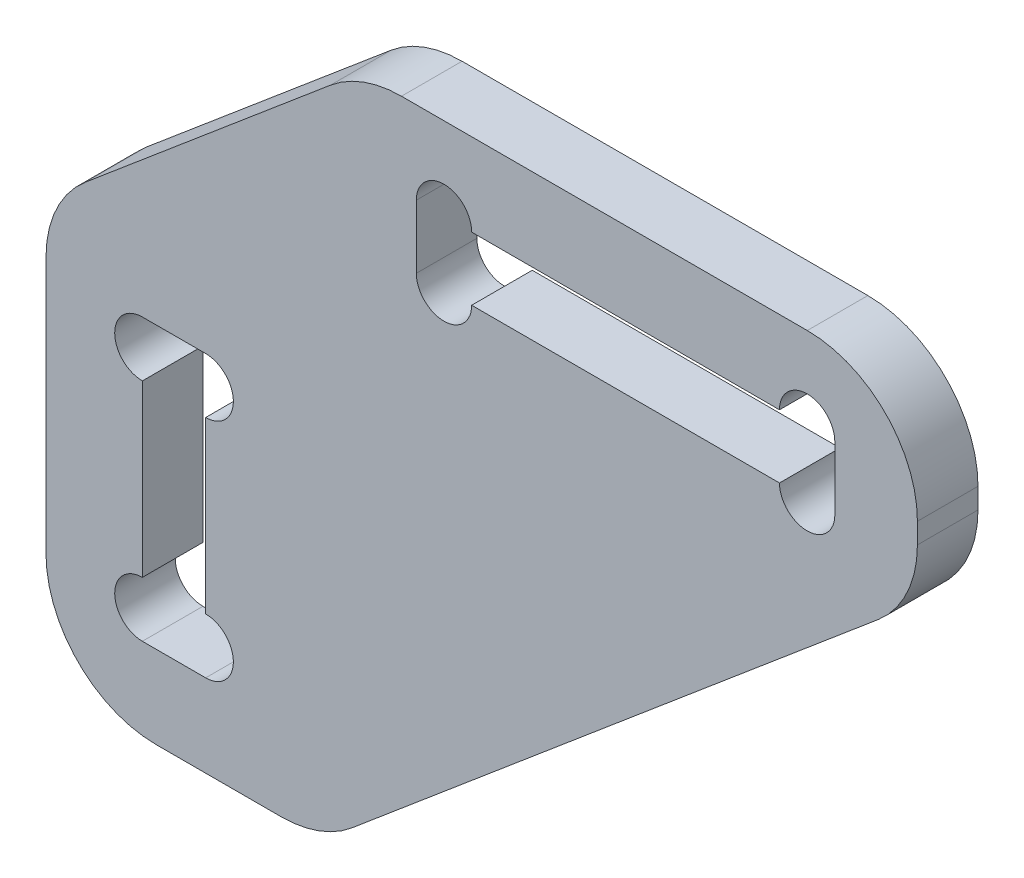
ISO-10303-21;
HEADER;
FILE_DESCRIPTION(('STEP AP214'),'2;1');
FILE_NAME('part.step','',(''),(''),'','','');
FILE_SCHEMA(('AUTOMOTIVE_DESIGN { 1 0 10303 214 1 1 1 1 }'));
ENDSEC;
DATA;
#1=APPLICATION_CONTEXT('core data for automotive mechanical design processes');
#2=APPLICATION_PROTOCOL_DEFINITION('international standard','automotive_design',2000,#1);
#3=PRODUCT_CONTEXT('',#1,'mechanical');
#4=PRODUCT('Part','Part','',(#3));
#5=PRODUCT_RELATED_PRODUCT_CATEGORY('part','',(#4));
#6=PRODUCT_DEFINITION_FORMATION('','',#4);
#7=PRODUCT_DEFINITION_CONTEXT('part definition',#1,'design');
#8=PRODUCT_DEFINITION('design','',#6,#7);
#9=PRODUCT_DEFINITION_SHAPE('','',#8);
#10=(LENGTH_UNIT() NAMED_UNIT(*) SI_UNIT(.MILLI.,.METRE.));
#11=(NAMED_UNIT(*) PLANE_ANGLE_UNIT() SI_UNIT($,.RADIAN.));
#12=(NAMED_UNIT(*) SI_UNIT($,.STERADIAN.) SOLID_ANGLE_UNIT());
#13=UNCERTAINTY_MEASURE_WITH_UNIT(LENGTH_MEASURE(1.E-05),#10,'distance_accuracy_value','');
#14=(GEOMETRIC_REPRESENTATION_CONTEXT(3) GLOBAL_UNCERTAINTY_ASSIGNED_CONTEXT((#13)) GLOBAL_UNIT_ASSIGNED_CONTEXT((#10,
#11,#12)) REPRESENTATION_CONTEXT('',''));
#15=CARTESIAN_POINT('',(0.,0.,0.));
#16=DIRECTION('',(0.,0.,1.));
#17=DIRECTION('',(1.,0.,0.));
#18=AXIS2_PLACEMENT_3D('',#15,#16,#17);
#19=CARTESIAN_POINT('',(-6.03197625153306,7.15711171814026,2.2));
#20=DIRECTION('',(-0.644444166774471,0.764651368867118,0.));
#21=DIRECTION('',(-0.764651368867118,-0.644444166774471,0.));
#22=AXIS2_PLACEMENT_3D('',#19,#20,#21);
#23=PLANE('',#22);
#24=DIRECTION('',(0.764651368867119,0.644444166774471,0.));
#25=VECTOR('',#24,1.);
#26=CARTESIAN_POINT('',(-6.03197625153306,7.15711171814026,0.));
#27=LINE('',#26,#25);
#28=CARTESIAN_POINT('',(-19.6277766670979,-4.30135762772878,0.));
#29=VERTEX_POINT('',#28);
#30=CARTESIAN_POINT('',(-10.7169914306618,3.20860547546847,0.));
#31=VERTEX_POINT('',#30);
#32=EDGE_CURVE('E353',#29,#31,#27,.T.);
#33=ORIENTED_EDGE('',*,*,#32,.F.);
#34=DIRECTION('',(0.,0.,-1.));
#35=VECTOR('',#34,1.);
#36=CARTESIAN_POINT('',(-19.6277766670979,-4.30135762772878,2.2));
#37=LINE('',#36,#35);
#38=CARTESIAN_POINT('',(-19.6277766670979,-4.30135762772878,2.2));
#39=VERTEX_POINT('',#38);
#40=EDGE_CURVE('E11',#29,#39,#37,.F.);
#41=ORIENTED_EDGE('',*,*,#40,.T.);
#42=DIRECTION('',(0.764651368867119,0.644444166774471,0.));
#43=VECTOR('',#42,1.);
#44=CARTESIAN_POINT('',(-6.03197625153306,7.15711171814026,2.2));
#45=LINE('',#44,#43);
#46=CARTESIAN_POINT('',(-10.7169914306618,3.20860547546847,2.2));
#47=VERTEX_POINT('',#46);
#48=EDGE_CURVE('E290',#39,#47,#45,.T.);
#49=ORIENTED_EDGE('',*,*,#48,.T.);
#50=DIRECTION('',(0.,0.,-1.));
#51=VECTOR('',#50,1.);
#52=CARTESIAN_POINT('',(-10.7169914306618,3.20860547546847,2.2));
#53=LINE('',#52,#51);
#54=EDGE_CURVE('E44',#47,#31,#53,.T.);
#55=ORIENTED_EDGE('',*,*,#54,.T.);
#56=EDGE_LOOP('',(#33,#41,#49,#55));
#57=FACE_BOUND('',#56,.T.);
#58=ADVANCED_FACE('F36',(#57),#23,.T.);
#59=CARTESIAN_POINT('',(-21.05,0.,2.2));
#60=DIRECTION('',(-1.,0.,0.));
#61=DIRECTION('',(0.,0.,1.));
#62=AXIS2_PLACEMENT_3D('',#59,#60,#61);
#63=PLANE('',#62);
#64=DIRECTION('',(0.,1.,0.));
#65=VECTOR('',#64,1.);
#66=CARTESIAN_POINT('',(-21.05,0.,0.));
#67=LINE('',#66,#65);
#68=CARTESIAN_POINT('',(-21.05,-16.7,0.));
#69=VERTEX_POINT('',#68);
#70=CARTESIAN_POINT('',(-21.05,-7.35996310319725,0.));
#71=VERTEX_POINT('',#70);
#72=EDGE_CURVE('E356',#69,#71,#67,.T.);
#73=ORIENTED_EDGE('',*,*,#72,.F.);
#74=DIRECTION('',(0.,0.,-1.));
#75=VECTOR('',#74,1.);
#76=CARTESIAN_POINT('',(-21.05,-16.7,2.2));
#77=LINE('',#76,#75);
#78=CARTESIAN_POINT('',(-21.05,-16.7,2.2));
#79=VERTEX_POINT('',#78);
#80=EDGE_CURVE('E439',#69,#79,#77,.F.);
#81=ORIENTED_EDGE('',*,*,#80,.T.);
#82=DIRECTION('',(0.,1.,0.));
#83=VECTOR('',#82,1.);
#84=CARTESIAN_POINT('',(-21.05,0.,2.2));
#85=LINE('',#84,#83);
#86=CARTESIAN_POINT('',(-21.05,-7.35996310319725,2.2));
#87=VERTEX_POINT('',#86);
#88=EDGE_CURVE('E293',#79,#87,#85,.T.);
#89=ORIENTED_EDGE('',*,*,#88,.T.);
#90=DIRECTION('',(0.,0.,-1.));
#91=VECTOR('',#90,1.);
#92=CARTESIAN_POINT('',(-21.05,-7.35996310319725,2.2));
#93=LINE('',#92,#91);
#94=EDGE_CURVE('E436',#87,#71,#93,.T.);
#95=ORIENTED_EDGE('',*,*,#94,.T.);
#96=EDGE_LOOP('',(#73,#81,#89,#95));
#97=FACE_BOUND('',#96,.T.);
#98=ADVANCED_FACE('F457',(#97),#63,.T.);
#99=CARTESIAN_POINT('',(0.,-20.7,2.2));
#100=DIRECTION('',(0.,-1.,0.));
#101=DIRECTION('',(0.,0.,-1.));
#102=AXIS2_PLACEMENT_3D('',#99,#100,#101);
#103=PLANE('',#102);
#104=DIRECTION('',(-1.,0.,0.));
#105=VECTOR('',#104,1.);
#106=CARTESIAN_POINT('',(0.,-20.7,0.));
#107=LINE('',#106,#105);
#108=CARTESIAN_POINT('',(-12.5107852364361,-20.7,0.));
#109=VERTEX_POINT('',#108);
#110=CARTESIAN_POINT('',(-17.05,-20.7,0.));
#111=VERTEX_POINT('',#110);
#112=EDGE_CURVE('E359',#109,#111,#107,.T.);
#113=ORIENTED_EDGE('',*,*,#112,.F.);
#114=DIRECTION('',(0.,0.,-1.));
#115=VECTOR('',#114,1.);
#116=CARTESIAN_POINT('',(-12.5107852364361,-20.7,2.2));
#117=LINE('',#116,#115);
#118=CARTESIAN_POINT('',(-12.5107852364361,-20.7,2.2));
#119=VERTEX_POINT('',#118);
#120=EDGE_CURVE('E434',#109,#119,#117,.F.);
#121=ORIENTED_EDGE('',*,*,#120,.T.);
#122=DIRECTION('',(-1.,0.,0.));
#123=VECTOR('',#122,1.);
#124=CARTESIAN_POINT('',(0.,-20.7,2.2));
#125=LINE('',#124,#123);
#126=CARTESIAN_POINT('',(-17.05,-20.7,2.2));
#127=VERTEX_POINT('',#126);
#128=EDGE_CURVE('E296',#119,#127,#125,.T.);
#129=ORIENTED_EDGE('',*,*,#128,.T.);
#130=DIRECTION('',(0.,0.,-1.));
#131=VECTOR('',#130,1.);
#132=CARTESIAN_POINT('',(-17.05,-20.7,2.2));
#133=LINE('',#132,#131);
#134=EDGE_CURVE('E431',#127,#111,#133,.T.);
#135=ORIENTED_EDGE('',*,*,#134,.T.);
#136=EDGE_LOOP('',(#113,#121,#129,#135));
#137=FACE_BOUND('',#136,.T.);
#138=ADVANCED_FACE('F467',(#137),#103,.T.);
#139=CARTESIAN_POINT('',(5.6112883264578,-6.65795350652247,2.2));
#140=DIRECTION('',(0.644444166774471,-0.764651368867118,0.));
#141=DIRECTION('',(0.764651368867118,0.644444166774471,0.));
#142=AXIS2_PLACEMENT_3D('',#139,#140,#141);
#143=PLANE('',#142);
#144=DIRECTION('',(-0.764651368867118,-0.644444166774471,0.));
#145=VECTOR('',#144,1.);
#146=CARTESIAN_POINT('',(5.6112883264578,-6.65795350652247,0.));
#147=LINE('',#146,#145);
#148=CARTESIAN_POINT('',(9.17777666709789,-3.65213582205287,0.));
#149=VERTEX_POINT('',#148);
#150=CARTESIAN_POINT('',(-9.93300856933824,-19.7586054754685,0.));
#151=VERTEX_POINT('',#150);
#152=EDGE_CURVE('E362',#149,#151,#147,.T.);
#153=ORIENTED_EDGE('',*,*,#152,.F.);
#154=DIRECTION('',(0.,0.,-1.));
#155=VECTOR('',#154,1.);
#156=CARTESIAN_POINT('',(9.17777666709789,-3.65213582205287,2.2));
#157=LINE('',#156,#155);
#158=CARTESIAN_POINT('',(9.17777666709789,-3.65213582205287,2.2));
#159=VERTEX_POINT('',#158);
#160=EDGE_CURVE('E58',#149,#159,#157,.F.);
#161=ORIENTED_EDGE('',*,*,#160,.T.);
#162=DIRECTION('',(-0.764651368867118,-0.644444166774471,0.));
#163=VECTOR('',#162,1.);
#164=CARTESIAN_POINT('',(5.6112883264578,-6.65795350652247,2.2));
#165=LINE('',#164,#163);
#166=CARTESIAN_POINT('',(-9.93300856933824,-19.7586054754685,2.2));
#167=VERTEX_POINT('',#166);
#168=EDGE_CURVE('E299',#159,#167,#165,.T.);
#169=ORIENTED_EDGE('',*,*,#168,.T.);
#170=DIRECTION('',(0.,0.,-1.));
#171=VECTOR('',#170,1.);
#172=CARTESIAN_POINT('',(-9.93300856933824,-19.7586054754685,2.2));
#173=LINE('',#172,#171);
#174=EDGE_CURVE('E427',#167,#151,#173,.T.);
#175=ORIENTED_EDGE('',*,*,#174,.T.);
#176=EDGE_LOOP('',(#153,#161,#169,#175));
#177=FACE_BOUND('',#176,.T.);
#178=ADVANCED_FACE('F472',(#177),#143,.T.);
#179=CARTESIAN_POINT('',(10.6,0.,2.2));
#180=DIRECTION('',(1.,0.,0.));
#181=DIRECTION('',(0.,1.,0.));
#182=AXIS2_PLACEMENT_3D('',#179,#180,#181);
#183=PLANE('',#182);
#184=DIRECTION('',(0.,-1.,0.));
#185=VECTOR('',#184,1.);
#186=CARTESIAN_POINT('',(10.6,0.,0.));
#187=LINE('',#186,#185);
#188=CARTESIAN_POINT('',(10.6,0.149999999999998,0.));
#189=VERTEX_POINT('',#188);
#190=CARTESIAN_POINT('',(10.6,-0.5935303465844,0.));
#191=VERTEX_POINT('',#190);
#192=EDGE_CURVE('E252',#189,#191,#187,.T.);
#193=ORIENTED_EDGE('',*,*,#192,.F.);
#194=DIRECTION('',(0.,0.,-1.));
#195=VECTOR('',#194,1.);
#196=CARTESIAN_POINT('',(10.6,0.149999999999998,2.2));
#197=LINE('',#196,#195);
#198=CARTESIAN_POINT('',(10.6,0.149999999999998,2.2));
#199=VERTEX_POINT('',#198);
#200=EDGE_CURVE('E414',#189,#199,#197,.F.);
#201=ORIENTED_EDGE('',*,*,#200,.T.);
#202=DIRECTION('',(0.,-1.,0.));
#203=VECTOR('',#202,1.);
#204=CARTESIAN_POINT('',(10.6,0.,2.2));
#205=LINE('',#204,#203);
#206=CARTESIAN_POINT('',(10.6,-0.5935303465844,2.2));
#207=VERTEX_POINT('',#206);
#208=EDGE_CURVE('E301',#199,#207,#205,.T.);
#209=ORIENTED_EDGE('',*,*,#208,.T.);
#210=DIRECTION('',(0.,0.,-1.));
#211=VECTOR('',#210,1.);
#212=CARTESIAN_POINT('',(10.6,-0.5935303465844,2.2));
#213=LINE('',#212,#211);
#214=EDGE_CURVE('E411',#207,#191,#213,.T.);
#215=ORIENTED_EDGE('',*,*,#214,.T.);
#216=EDGE_LOOP('',(#193,#201,#209,#215));
#217=FACE_BOUND('',#216,.T.);
#218=ADVANCED_FACE('F479',(#217),#183,.T.);
#219=CARTESIAN_POINT('',(6.595,1.15,2.2));
#220=DIRECTION('',(0.,0.,-1.));
#221=DIRECTION('',(-1.,0.,0.));
#222=AXIS2_PLACEMENT_3D('',#219,#220,#221);
#223=CYLINDRICAL_SURFACE('',#222,1.005);
#224=CARTESIAN_POINT('',(6.595,1.15,0.));
#225=DIRECTION('',(0.,0.,1.));
#226=DIRECTION('',(1.,0.,0.));
#227=AXIS2_PLACEMENT_3D('',#224,#225,#226);
#228=CIRCLE('',#227,1.005);
#229=CARTESIAN_POINT('',(7.6,1.15,0.));
#230=VERTEX_POINT('',#229);
#231=CARTESIAN_POINT('',(5.59,1.15,0.));
#232=VERTEX_POINT('',#231);
#233=EDGE_CURVE('E329',#230,#232,#228,.T.);
#234=ORIENTED_EDGE('',*,*,#233,.F.);
#235=DIRECTION('',(0.,0.,-1.));
#236=VECTOR('',#235,1.);
#237=CARTESIAN_POINT('',(7.6,1.15,2.2));
#238=LINE('',#237,#236);
#239=CARTESIAN_POINT('',(7.6,1.15,2.2));
#240=VERTEX_POINT('',#239);
#241=EDGE_CURVE('E380',#240,#230,#238,.T.);
#242=ORIENTED_EDGE('',*,*,#241,.F.);
#243=CARTESIAN_POINT('',(6.595,1.15,2.2));
#244=DIRECTION('',(0.,0.,1.));
#245=DIRECTION('',(1.,0.,0.));
#246=AXIS2_PLACEMENT_3D('',#243,#244,#245);
#247=CIRCLE('',#246,1.005);
#248=CARTESIAN_POINT('',(5.59,1.15,2.2));
#249=VERTEX_POINT('',#248);
#250=EDGE_CURVE('E268',#240,#249,#247,.T.);
#251=ORIENTED_EDGE('',*,*,#250,.T.);
#252=DIRECTION('',(0.,0.,-1.));
#253=VECTOR('',#252,1.);
#254=CARTESIAN_POINT('',(5.59,1.15,2.2));
#255=LINE('',#254,#253);
#256=EDGE_CURVE('E233',#249,#232,#255,.T.);
#257=ORIENTED_EDGE('',*,*,#256,.T.);
#258=EDGE_LOOP('',(#234,#242,#251,#257));
#259=FACE_BOUND('',#258,.T.);
#260=ADVANCED_FACE('F530',(#259),#223,.F.);
#261=CARTESIAN_POINT('',(7.6,0.,2.2));
#262=DIRECTION('',(-1.,0.,0.));
#263=DIRECTION('',(0.,0.,1.));
#264=AXIS2_PLACEMENT_3D('',#261,#262,#263);
#265=PLANE('',#264);
#266=DIRECTION('',(0.,1.,0.));
#267=VECTOR('',#266,1.);
#268=CARTESIAN_POINT('',(7.6,0.,0.));
#269=LINE('',#268,#267);
#270=CARTESIAN_POINT('',(7.6,-1.15,0.));
#271=VERTEX_POINT('',#270);
#272=EDGE_CURVE('E332',#271,#230,#269,.T.);
#273=ORIENTED_EDGE('',*,*,#272,.F.);
#274=DIRECTION('',(0.,0.,-1.));
#275=VECTOR('',#274,1.);
#276=CARTESIAN_POINT('',(7.6,-1.15,2.2));
#277=LINE('',#276,#275);
#278=CARTESIAN_POINT('',(7.6,-1.15,2.2));
#279=VERTEX_POINT('',#278);
#280=EDGE_CURVE('E378',#279,#271,#277,.T.);
#281=ORIENTED_EDGE('',*,*,#280,.F.);
#282=DIRECTION('',(0.,1.,0.));
#283=VECTOR('',#282,1.);
#284=CARTESIAN_POINT('',(7.6,0.,2.2));
#285=LINE('',#284,#283);
#286=EDGE_CURVE('E271',#279,#240,#285,.T.);
#287=ORIENTED_EDGE('',*,*,#286,.T.);
#288=ORIENTED_EDGE('',*,*,#241,.T.);
#289=EDGE_LOOP('',(#273,#281,#287,#288));
#290=FACE_BOUND('',#289,.T.);
#291=ADVANCED_FACE('F526',(#290),#265,.T.);
#292=CARTESIAN_POINT('',(6.595,-1.15,2.2));
#293=DIRECTION('',(0.,0.,-1.));
#294=DIRECTION('',(-1.,0.,0.));
#295=AXIS2_PLACEMENT_3D('',#292,#293,#294);
#296=CYLINDRICAL_SURFACE('',#295,1.005);
#297=CARTESIAN_POINT('',(6.595,-1.15,0.));
#298=DIRECTION('',(0.,0.,1.));
#299=DIRECTION('',(1.,0.,0.));
#300=AXIS2_PLACEMENT_3D('',#297,#298,#299);
#301=CIRCLE('',#300,1.005);
#302=CARTESIAN_POINT('',(5.59,-1.15,0.));
#303=VERTEX_POINT('',#302);
#304=EDGE_CURVE('E335',#303,#271,#301,.T.);
#305=ORIENTED_EDGE('',*,*,#304,.F.);
#306=DIRECTION('',(0.,0.,-1.));
#307=VECTOR('',#306,1.);
#308=CARTESIAN_POINT('',(5.59,-1.15,2.2));
#309=LINE('',#308,#307);
#310=CARTESIAN_POINT('',(5.59,-1.15,2.2));
#311=VERTEX_POINT('',#310);
#312=EDGE_CURVE('E376',#311,#303,#309,.T.);
#313=ORIENTED_EDGE('',*,*,#312,.F.);
#314=CARTESIAN_POINT('',(6.595,-1.15,2.2));
#315=DIRECTION('',(0.,0.,1.));
#316=DIRECTION('',(1.,0.,0.));
#317=AXIS2_PLACEMENT_3D('',#314,#315,#316);
#318=CIRCLE('',#317,1.005);
#319=EDGE_CURVE('E274',#311,#279,#318,.T.);
#320=ORIENTED_EDGE('',*,*,#319,.T.);
#321=ORIENTED_EDGE('',*,*,#280,.T.);
#322=EDGE_LOOP('',(#305,#313,#320,#321));
#323=FACE_BOUND('',#322,.T.);
#324=ADVANCED_FACE('F522',(#323),#296,.F.);
#325=CARTESIAN_POINT('',(0.,-1.15,2.2));
#326=DIRECTION('',(0.,-1.,0.));
#327=DIRECTION('',(1.,0.,0.));
#328=AXIS2_PLACEMENT_3D('',#325,#326,#327);
#329=PLANE('',#328);
#330=DIRECTION('',(-1.,0.,0.));
#331=VECTOR('',#330,1.);
#332=CARTESIAN_POINT('',(0.,-1.15,0.));
#333=LINE('',#332,#331);
#334=CARTESIAN_POINT('',(-5.59,-1.15,0.));
#335=VERTEX_POINT('',#334);
#336=EDGE_CURVE('E338',#303,#335,#333,.T.);
#337=ORIENTED_EDGE('',*,*,#336,.T.);
#338=DIRECTION('',(0.,0.,-1.));
#339=VECTOR('',#338,1.);
#340=CARTESIAN_POINT('',(-5.59,-1.15,2.2));
#341=LINE('',#340,#339);
#342=CARTESIAN_POINT('',(-5.59,-1.15,2.2));
#343=VERTEX_POINT('',#342);
#344=EDGE_CURVE('E374',#343,#335,#341,.T.);
#345=ORIENTED_EDGE('',*,*,#344,.F.);
#346=DIRECTION('',(-1.,0.,0.));
#347=VECTOR('',#346,1.);
#348=CARTESIAN_POINT('',(0.,-1.15,2.2));
#349=LINE('',#348,#347);
#350=EDGE_CURVE('E277',#311,#343,#349,.T.);
#351=ORIENTED_EDGE('',*,*,#350,.F.);
#352=ORIENTED_EDGE('',*,*,#312,.T.);
#353=EDGE_LOOP('',(#337,#345,#351,#352));
#354=FACE_BOUND('',#353,.T.);
#355=ADVANCED_FACE('F518',(#354),#329,.F.);
#356=CARTESIAN_POINT('',(-6.595,-1.15,2.2));
#357=DIRECTION('',(0.,0.,-1.));
#358=DIRECTION('',(-1.,0.,0.));
#359=AXIS2_PLACEMENT_3D('',#356,#357,#358);
#360=CYLINDRICAL_SURFACE('',#359,1.005);
#361=CARTESIAN_POINT('',(-6.595,-1.15,0.));
#362=DIRECTION('',(0.,0.,1.));
#363=DIRECTION('',(1.,0.,0.));
#364=AXIS2_PLACEMENT_3D('',#361,#362,#363);
#365=CIRCLE('',#364,1.005);
#366=CARTESIAN_POINT('',(-7.6,-1.15,0.));
#367=VERTEX_POINT('',#366);
#368=EDGE_CURVE('E341',#367,#335,#365,.T.);
#369=ORIENTED_EDGE('',*,*,#368,.F.);
#370=DIRECTION('',(0.,0.,-1.));
#371=VECTOR('',#370,1.);
#372=CARTESIAN_POINT('',(-7.6,-1.15,2.2));
#373=LINE('',#372,#371);
#374=CARTESIAN_POINT('',(-7.6,-1.15,2.2));
#375=VERTEX_POINT('',#374);
#376=EDGE_CURVE('E372',#375,#367,#373,.T.);
#377=ORIENTED_EDGE('',*,*,#376,.F.);
#378=CARTESIAN_POINT('',(-6.595,-1.15,2.2));
#379=DIRECTION('',(0.,0.,1.));
#380=DIRECTION('',(1.,0.,0.));
#381=AXIS2_PLACEMENT_3D('',#378,#379,#380);
#382=CIRCLE('',#381,1.005);
#383=EDGE_CURVE('E279',#375,#343,#382,.T.);
#384=ORIENTED_EDGE('',*,*,#383,.T.);
#385=ORIENTED_EDGE('',*,*,#344,.T.);
#386=EDGE_LOOP('',(#369,#377,#384,#385));
#387=FACE_BOUND('',#386,.T.);
#388=ADVANCED_FACE('F514',(#387),#360,.F.);
#389=CARTESIAN_POINT('',(-7.6,0.,2.2));
#390=DIRECTION('',(-1.,0.,0.));
#391=DIRECTION('',(0.,0.,1.));
#392=AXIS2_PLACEMENT_3D('',#389,#390,#391);
#393=PLANE('',#392);
#394=DIRECTION('',(0.,1.,0.));
#395=VECTOR('',#394,1.);
#396=CARTESIAN_POINT('',(-7.6,0.,0.));
#397=LINE('',#396,#395);
#398=CARTESIAN_POINT('',(-7.6,1.15,0.));
#399=VERTEX_POINT('',#398);
#400=EDGE_CURVE('E344',#367,#399,#397,.T.);
#401=ORIENTED_EDGE('',*,*,#400,.T.);
#402=DIRECTION('',(0.,0.,-1.));
#403=VECTOR('',#402,1.);
#404=CARTESIAN_POINT('',(-7.6,1.15,2.2));
#405=LINE('',#404,#403);
#406=CARTESIAN_POINT('',(-7.6,1.15,2.2));
#407=VERTEX_POINT('',#406);
#408=EDGE_CURVE('E370',#407,#399,#405,.T.);
#409=ORIENTED_EDGE('',*,*,#408,.F.);
#410=DIRECTION('',(0.,1.,0.));
#411=VECTOR('',#410,1.);
#412=CARTESIAN_POINT('',(-7.6,0.,2.2));
#413=LINE('',#412,#411);
#414=EDGE_CURVE('E282',#375,#407,#413,.T.);
#415=ORIENTED_EDGE('',*,*,#414,.F.);
#416=ORIENTED_EDGE('',*,*,#376,.T.);
#417=EDGE_LOOP('',(#401,#409,#415,#416));
#418=FACE_BOUND('',#417,.T.);
#419=ADVANCED_FACE('F510',(#418),#393,.F.);
#420=CARTESIAN_POINT('',(-6.595,1.15,2.2));
#421=DIRECTION('',(0.,0.,-1.));
#422=DIRECTION('',(-1.,0.,0.));
#423=AXIS2_PLACEMENT_3D('',#420,#421,#422);
#424=CYLINDRICAL_SURFACE('',#423,1.005);
#425=CARTESIAN_POINT('',(-6.595,1.15,0.));
#426=DIRECTION('',(0.,0.,1.));
#427=DIRECTION('',(1.,0.,0.));
#428=AXIS2_PLACEMENT_3D('',#425,#426,#427);
#429=CIRCLE('',#428,1.005);
#430=CARTESIAN_POINT('',(-5.59,1.15,0.));
#431=VERTEX_POINT('',#430);
#432=EDGE_CURVE('E347',#431,#399,#429,.T.);
#433=ORIENTED_EDGE('',*,*,#432,.F.);
#434=DIRECTION('',(0.,0.,-1.));
#435=VECTOR('',#434,1.);
#436=CARTESIAN_POINT('',(-5.59,1.15,2.2));
#437=LINE('',#436,#435);
#438=CARTESIAN_POINT('',(-5.59,1.15,2.2));
#439=VERTEX_POINT('',#438);
#440=EDGE_CURVE('E368',#439,#431,#437,.T.);
#441=ORIENTED_EDGE('',*,*,#440,.F.);
#442=CARTESIAN_POINT('',(-6.595,1.15,2.2));
#443=DIRECTION('',(0.,0.,1.));
#444=DIRECTION('',(1.,0.,0.));
#445=AXIS2_PLACEMENT_3D('',#442,#443,#444);
#446=CIRCLE('',#445,1.005);
#447=EDGE_CURVE('E284',#439,#407,#446,.T.);
#448=ORIENTED_EDGE('',*,*,#447,.T.);
#449=ORIENTED_EDGE('',*,*,#408,.T.);
#450=EDGE_LOOP('',(#433,#441,#448,#449));
#451=FACE_BOUND('',#450,.T.);
#452=ADVANCED_FACE('F507',(#451),#424,.F.);
#453=CARTESIAN_POINT('',(-15.25,-16.695,2.2));
#454=DIRECTION('',(0.,0.,-1.));
#455=DIRECTION('',(-1.,0.,0.));
#456=AXIS2_PLACEMENT_3D('',#453,#454,#455);
#457=CYLINDRICAL_SURFACE('',#456,1.005);
#458=CARTESIAN_POINT('',(-15.25,-16.695,0.));
#459=DIRECTION('',(0.,0.,1.));
#460=DIRECTION('',(1.,0.,0.));
#461=AXIS2_PLACEMENT_3D('',#458,#459,#460);
#462=CIRCLE('',#461,1.005);
#463=CARTESIAN_POINT('',(-15.25,-17.7,0.));
#464=VERTEX_POINT('',#463);
#465=CARTESIAN_POINT('',(-15.25,-15.69,0.));
#466=VERTEX_POINT('',#465);
#467=EDGE_CURVE('E229',#464,#466,#462,.T.);
#468=ORIENTED_EDGE('',*,*,#467,.F.);
#469=DIRECTION('',(0.,0.,-1.));
#470=VECTOR('',#469,1.);
#471=CARTESIAN_POINT('',(-15.25,-17.7,2.2));
#472=LINE('',#471,#470);
#473=CARTESIAN_POINT('',(-15.25,-17.7,2.2));
#474=VERTEX_POINT('',#473);
#475=EDGE_CURVE('E222',#474,#464,#472,.T.);
#476=ORIENTED_EDGE('',*,*,#475,.F.);
#477=CARTESIAN_POINT('',(-15.25,-16.695,2.2));
#478=DIRECTION('',(0.,0.,1.));
#479=DIRECTION('',(1.,0.,0.));
#480=AXIS2_PLACEMENT_3D('',#477,#478,#479);
#481=CIRCLE('',#480,1.005);
#482=CARTESIAN_POINT('',(-15.25,-15.69,2.2));
#483=VERTEX_POINT('',#482);
#484=EDGE_CURVE('E226',#474,#483,#481,.T.);
#485=ORIENTED_EDGE('',*,*,#484,.T.);
#486=DIRECTION('',(0.,0.,-1.));
#487=VECTOR('',#486,1.);
#488=CARTESIAN_POINT('',(-15.25,-15.69,2.2));
#489=LINE('',#488,#487);
#490=EDGE_CURVE('E307',#483,#466,#489,.T.);
#491=ORIENTED_EDGE('',*,*,#490,.T.);
#492=EDGE_LOOP('',(#468,#476,#485,#491));
#493=FACE_BOUND('',#492,.T.);
#494=ADVANCED_FACE('F224',(#493),#457,.F.);
#495=CARTESIAN_POINT('',(0.,-17.7,2.2));
#496=DIRECTION('',(0.,-1.,0.));
#497=DIRECTION('',(1.,0.,0.));
#498=AXIS2_PLACEMENT_3D('',#495,#496,#497);
#499=PLANE('',#498);
#500=DIRECTION('',(-1.,0.,0.));
#501=VECTOR('',#500,1.);
#502=CARTESIAN_POINT('',(0.,-17.7,0.));
#503=LINE('',#502,#501);
#504=CARTESIAN_POINT('',(-17.55,-17.7,0.));
#505=VERTEX_POINT('',#504);
#506=EDGE_CURVE('E309',#464,#505,#503,.T.);
#507=ORIENTED_EDGE('',*,*,#506,.T.);
#508=DIRECTION('',(0.,0.,-1.));
#509=VECTOR('',#508,1.);
#510=CARTESIAN_POINT('',(-17.55,-17.7,2.2));
#511=LINE('',#510,#509);
#512=CARTESIAN_POINT('',(-17.55,-17.7,2.2));
#513=VERTEX_POINT('',#512);
#514=EDGE_CURVE('E234',#513,#505,#511,.T.);
#515=ORIENTED_EDGE('',*,*,#514,.F.);
#516=DIRECTION('',(-1.,0.,0.));
#517=VECTOR('',#516,1.);
#518=CARTESIAN_POINT('',(0.,-17.7,2.2));
#519=LINE('',#518,#517);
#520=EDGE_CURVE('E237',#474,#513,#519,.T.);
#521=ORIENTED_EDGE('',*,*,#520,.F.);
#522=ORIENTED_EDGE('',*,*,#475,.T.);
#523=EDGE_LOOP('',(#507,#515,#521,#522));
#524=FACE_BOUND('',#523,.T.);
#525=ADVANCED_FACE('F238',(#524),#499,.F.);
#526=CARTESIAN_POINT('',(-17.55,-16.695,2.2));
#527=DIRECTION('',(0.,0.,-1.));
#528=DIRECTION('',(-1.,0.,0.));
#529=AXIS2_PLACEMENT_3D('',#526,#527,#528);
#530=CYLINDRICAL_SURFACE('',#529,1.005);
#531=CARTESIAN_POINT('',(-17.55,-16.695,0.));
#532=DIRECTION('',(0.,0.,1.));
#533=DIRECTION('',(1.,0.,0.));
#534=AXIS2_PLACEMENT_3D('',#531,#532,#533);
#535=CIRCLE('',#534,1.005);
#536=CARTESIAN_POINT('',(-17.55,-15.69,0.));
#537=VERTEX_POINT('',#536);
#538=EDGE_CURVE('E311',#537,#505,#535,.T.);
#539=ORIENTED_EDGE('',*,*,#538,.F.);
#540=DIRECTION('',(0.,0.,-1.));
#541=VECTOR('',#540,1.);
#542=CARTESIAN_POINT('',(-17.55,-15.69,2.2));
#543=LINE('',#542,#541);
#544=CARTESIAN_POINT('',(-17.55,-15.69,2.2));
#545=VERTEX_POINT('',#544);
#546=EDGE_CURVE('E392',#545,#537,#543,.T.);
#547=ORIENTED_EDGE('',*,*,#546,.F.);
#548=CARTESIAN_POINT('',(-17.55,-16.695,2.2));
#549=DIRECTION('',(0.,0.,1.));
#550=DIRECTION('',(1.,0.,0.));
#551=AXIS2_PLACEMENT_3D('',#548,#549,#550);
#552=CIRCLE('',#551,1.005);
#553=EDGE_CURVE('E242',#545,#513,#552,.T.);
#554=ORIENTED_EDGE('',*,*,#553,.T.);
#555=ORIENTED_EDGE('',*,*,#514,.T.);
#556=EDGE_LOOP('',(#539,#547,#554,#555));
#557=FACE_BOUND('',#556,.T.);
#558=ADVANCED_FACE('F552',(#557),#530,.F.);
#559=CARTESIAN_POINT('',(-17.55,0.,2.2));
#560=DIRECTION('',(-1.,0.,0.));
#561=DIRECTION('',(0.,-1.,0.));
#562=AXIS2_PLACEMENT_3D('',#559,#560,#561);
#563=PLANE('',#562);
#564=DIRECTION('',(0.,1.,0.));
#565=VECTOR('',#564,1.);
#566=CARTESIAN_POINT('',(-17.55,0.,0.));
#567=LINE('',#566,#565);
#568=CARTESIAN_POINT('',(-17.55,-9.51,0.));
#569=VERTEX_POINT('',#568);
#570=EDGE_CURVE('E314',#537,#569,#567,.T.);
#571=ORIENTED_EDGE('',*,*,#570,.T.);
#572=DIRECTION('',(0.,0.,-1.));
#573=VECTOR('',#572,1.);
#574=CARTESIAN_POINT('',(-17.55,-9.51,2.2));
#575=LINE('',#574,#573);
#576=CARTESIAN_POINT('',(-17.55,-9.51,2.2));
#577=VERTEX_POINT('',#576);
#578=EDGE_CURVE('E390',#577,#569,#575,.T.);
#579=ORIENTED_EDGE('',*,*,#578,.F.);
#580=DIRECTION('',(0.,1.,0.));
#581=VECTOR('',#580,1.);
#582=CARTESIAN_POINT('',(-17.55,0.,2.2));
#583=LINE('',#582,#581);
#584=EDGE_CURVE('E256',#545,#577,#583,.T.);
#585=ORIENTED_EDGE('',*,*,#584,.F.);
#586=ORIENTED_EDGE('',*,*,#546,.T.);
#587=EDGE_LOOP('',(#571,#579,#585,#586));
#588=FACE_BOUND('',#587,.T.);
#589=ADVANCED_FACE('F548',(#588),#563,.F.);
#590=CARTESIAN_POINT('',(-17.55,-8.505,2.2));
#591=DIRECTION('',(0.,0.,-1.));
#592=DIRECTION('',(-1.,0.,0.));
#593=AXIS2_PLACEMENT_3D('',#590,#591,#592);
#594=CYLINDRICAL_SURFACE('',#593,1.005);
#595=CARTESIAN_POINT('',(-17.55,-8.505,0.));
#596=DIRECTION('',(0.,0.,1.));
#597=DIRECTION('',(1.,0.,0.));
#598=AXIS2_PLACEMENT_3D('',#595,#596,#597);
#599=CIRCLE('',#598,1.005);
#600=CARTESIAN_POINT('',(-17.55,-7.5,0.));
#601=VERTEX_POINT('',#600);
#602=EDGE_CURVE('E317',#601,#569,#599,.T.);
#603=ORIENTED_EDGE('',*,*,#602,.F.);
#604=DIRECTION('',(0.,0.,-1.));
#605=VECTOR('',#604,1.);
#606=CARTESIAN_POINT('',(-17.55,-7.5,2.2));
#607=LINE('',#606,#605);
#608=CARTESIAN_POINT('',(-17.55,-7.5,2.2));
#609=VERTEX_POINT('',#608);
#610=EDGE_CURVE('E388',#609,#601,#607,.T.);
#611=ORIENTED_EDGE('',*,*,#610,.F.);
#612=CARTESIAN_POINT('',(-17.55,-8.505,2.2));
#613=DIRECTION('',(0.,0.,1.));
#614=DIRECTION('',(1.,0.,0.));
#615=AXIS2_PLACEMENT_3D('',#612,#613,#614);
#616=CIRCLE('',#615,1.005);
#617=EDGE_CURVE('E258',#609,#577,#616,.T.);
#618=ORIENTED_EDGE('',*,*,#617,.T.);
#619=ORIENTED_EDGE('',*,*,#578,.T.);
#620=EDGE_LOOP('',(#603,#611,#618,#619));
#621=FACE_BOUND('',#620,.T.);
#622=ADVANCED_FACE('F544',(#621),#594,.F.);
#623=CARTESIAN_POINT('',(0.,-7.5,2.2));
#624=DIRECTION('',(0.,-1.,0.));
#625=DIRECTION('',(1.,0.,0.));
#626=AXIS2_PLACEMENT_3D('',#623,#624,#625);
#627=PLANE('',#626);
#628=DIRECTION('',(-1.,0.,0.));
#629=VECTOR('',#628,1.);
#630=CARTESIAN_POINT('',(0.,-7.5,0.));
#631=LINE('',#630,#629);
#632=CARTESIAN_POINT('',(-15.25,-7.5,0.));
#633=VERTEX_POINT('',#632);
#634=EDGE_CURVE('E320',#633,#601,#631,.T.);
#635=ORIENTED_EDGE('',*,*,#634,.F.);
#636=DIRECTION('',(0.,0.,-1.));
#637=VECTOR('',#636,1.);
#638=CARTESIAN_POINT('',(-15.25,-7.5,2.2));
#639=LINE('',#638,#637);
#640=CARTESIAN_POINT('',(-15.25,-7.5,2.2));
#641=VERTEX_POINT('',#640);
#642=EDGE_CURVE('E386',#641,#633,#639,.T.);
#643=ORIENTED_EDGE('',*,*,#642,.F.);
#644=DIRECTION('',(-1.,0.,0.));
#645=VECTOR('',#644,1.);
#646=CARTESIAN_POINT('',(0.,-7.5,2.2));
#647=LINE('',#646,#645);
#648=EDGE_CURVE('E261',#641,#609,#647,.T.);
#649=ORIENTED_EDGE('',*,*,#648,.T.);
#650=ORIENTED_EDGE('',*,*,#610,.T.);
#651=EDGE_LOOP('',(#635,#643,#649,#650));
#652=FACE_BOUND('',#651,.T.);
#653=ADVANCED_FACE('F540',(#652),#627,.T.);
#654=CARTESIAN_POINT('',(-15.25,-8.505,2.2));
#655=DIRECTION('',(0.,0.,-1.));
#656=DIRECTION('',(-1.,0.,0.));
#657=AXIS2_PLACEMENT_3D('',#654,#655,#656);
#658=CYLINDRICAL_SURFACE('',#657,1.005);
#659=CARTESIAN_POINT('',(-15.25,-8.505,0.));
#660=DIRECTION('',(0.,0.,1.));
#661=DIRECTION('',(1.,0.,0.));
#662=AXIS2_PLACEMENT_3D('',#659,#660,#661);
#663=CIRCLE('',#662,1.005);
#664=CARTESIAN_POINT('',(-15.25,-9.51,0.));
#665=VERTEX_POINT('',#664);
#666=EDGE_CURVE('E323',#665,#633,#663,.T.);
#667=ORIENTED_EDGE('',*,*,#666,.F.);
#668=DIRECTION('',(0.,0.,-1.));
#669=VECTOR('',#668,1.);
#670=CARTESIAN_POINT('',(-15.25,-9.51,2.2));
#671=LINE('',#670,#669);
#672=CARTESIAN_POINT('',(-15.25,-9.51,2.2));
#673=VERTEX_POINT('',#672);
#674=EDGE_CURVE('E384',#673,#665,#671,.T.);
#675=ORIENTED_EDGE('',*,*,#674,.F.);
#676=CARTESIAN_POINT('',(-15.25,-8.505,2.2));
#677=DIRECTION('',(0.,0.,1.));
#678=DIRECTION('',(1.,0.,0.));
#679=AXIS2_PLACEMENT_3D('',#676,#677,#678);
#680=CIRCLE('',#679,1.005);
#681=EDGE_CURVE('E264',#673,#641,#680,.T.);
#682=ORIENTED_EDGE('',*,*,#681,.T.);
#683=ORIENTED_EDGE('',*,*,#642,.T.);
#684=EDGE_LOOP('',(#667,#675,#682,#683));
#685=FACE_BOUND('',#684,.T.);
#686=ADVANCED_FACE('F505',(#685),#658,.F.);
#687=CARTESIAN_POINT('',(0.,1.15,2.2));
#688=DIRECTION('',(0.,-1.,0.));
#689=DIRECTION('',(1.,0.,0.));
#690=AXIS2_PLACEMENT_3D('',#687,#688,#689);
#691=PLANE('',#690);
#692=DIRECTION('',(-1.,0.,0.));
#693=VECTOR('',#692,1.);
#694=CARTESIAN_POINT('',(0.,1.15,0.));
#695=LINE('',#694,#693);
#696=EDGE_CURVE('E350',#232,#431,#695,.T.);
#697=ORIENTED_EDGE('',*,*,#696,.F.);
#698=ORIENTED_EDGE('',*,*,#256,.F.);
#699=DIRECTION('',(-1.,0.,0.));
#700=VECTOR('',#699,1.);
#701=CARTESIAN_POINT('',(0.,1.15,2.2));
#702=LINE('',#701,#700);
#703=EDGE_CURVE('E287',#249,#439,#702,.T.);
#704=ORIENTED_EDGE('',*,*,#703,.T.);
#705=ORIENTED_EDGE('',*,*,#440,.T.);
#706=EDGE_LOOP('',(#697,#698,#704,#705));
#707=FACE_BOUND('',#706,.T.);
#708=ADVANCED_FACE('F501',(#707),#691,.T.);
#709=CARTESIAN_POINT('',(-15.25,0.,2.2));
#710=DIRECTION('',(-1.,0.,0.));
#711=DIRECTION('',(0.,0.,1.));
#712=AXIS2_PLACEMENT_3D('',#709,#710,#711);
#713=PLANE('',#712);
#714=DIRECTION('',(0.,1.,0.));
#715=VECTOR('',#714,1.);
#716=CARTESIAN_POINT('',(-15.25,0.,0.));
#717=LINE('',#716,#715);
#718=EDGE_CURVE('E326',#466,#665,#717,.T.);
#719=ORIENTED_EDGE('',*,*,#718,.F.);
#720=ORIENTED_EDGE('',*,*,#490,.F.);
#721=DIRECTION('',(0.,1.,0.));
#722=VECTOR('',#721,1.);
#723=CARTESIAN_POINT('',(-15.25,0.,2.2));
#724=LINE('',#723,#722);
#725=EDGE_CURVE('E248',#483,#673,#724,.T.);
#726=ORIENTED_EDGE('',*,*,#725,.T.);
#727=ORIENTED_EDGE('',*,*,#674,.T.);
#728=EDGE_LOOP('',(#719,#720,#726,#727));
#729=FACE_BOUND('',#728,.T.);
#730=ADVANCED_FACE('F504',(#729),#713,.T.);
#731=CARTESIAN_POINT('',(0.,4.15,2.2));
#732=DIRECTION('',(0.,1.,0.));
#733=DIRECTION('',(0.,0.,1.));
#734=AXIS2_PLACEMENT_3D('',#731,#732,#733);
#735=PLANE('',#734);
#736=DIRECTION('',(1.,0.,0.));
#737=VECTOR('',#736,1.);
#738=CARTESIAN_POINT('',(0.,4.15,2.2));
#739=LINE('',#738,#737);
#740=CARTESIAN_POINT('',(-8.13921476356388,4.15,2.2));
#741=VERTEX_POINT('',#740);
#742=CARTESIAN_POINT('',(6.6,4.15,2.2));
#743=VERTEX_POINT('',#742);
#744=EDGE_CURVE('E304',#741,#743,#739,.T.);
#745=ORIENTED_EDGE('',*,*,#744,.T.);
#746=DIRECTION('',(0.,0.,-1.));
#747=VECTOR('',#746,1.);
#748=CARTESIAN_POINT('',(6.6,4.15,2.2));
#749=LINE('',#748,#747);
#750=CARTESIAN_POINT('',(6.6,4.15,0.));
#751=VERTEX_POINT('',#750);
#752=EDGE_CURVE('E396',#743,#751,#749,.T.);
#753=ORIENTED_EDGE('',*,*,#752,.T.);
#754=DIRECTION('',(1.,0.,0.));
#755=VECTOR('',#754,1.);
#756=CARTESIAN_POINT('',(0.,4.15,0.));
#757=LINE('',#756,#755);
#758=CARTESIAN_POINT('',(-8.13921476356388,4.15,0.));
#759=VERTEX_POINT('',#758);
#760=EDGE_CURVE('E249',#759,#751,#757,.T.);
#761=ORIENTED_EDGE('',*,*,#760,.F.);
#762=DIRECTION('',(0.,0.,-1.));
#763=VECTOR('',#762,1.);
#764=CARTESIAN_POINT('',(-8.13921476356388,4.15,2.2));
#765=LINE('',#764,#763);
#766=EDGE_CURVE('E382',#759,#741,#765,.F.);
#767=ORIENTED_EDGE('',*,*,#766,.T.);
#768=EDGE_LOOP('',(#745,#753,#761,#767));
#769=FACE_BOUND('',#768,.T.);
#770=ADVANCED_FACE('F486',(#769),#735,.T.);
#771=CARTESIAN_POINT('',(0.,0.,2.2));
#772=DIRECTION('',(0.,0.,1.));
#773=DIRECTION('',(1.,0.,0.));
#774=AXIS2_PLACEMENT_3D('',#771,#772,#773);
#775=PLANE('',#774);
#776=ORIENTED_EDGE('',*,*,#484,.F.);
#777=ORIENTED_EDGE('',*,*,#520,.T.);
#778=ORIENTED_EDGE('',*,*,#553,.F.);
#779=ORIENTED_EDGE('',*,*,#584,.T.);
#780=ORIENTED_EDGE('',*,*,#617,.F.);
#781=ORIENTED_EDGE('',*,*,#648,.F.);
#782=ORIENTED_EDGE('',*,*,#681,.F.);
#783=ORIENTED_EDGE('',*,*,#725,.F.);
#784=EDGE_LOOP('',(#776,#777,#778,#779,#780,#781,#782,#783));
#785=FACE_BOUND('',#784,.T.);
#786=ORIENTED_EDGE('',*,*,#250,.F.);
#787=ORIENTED_EDGE('',*,*,#286,.F.);
#788=ORIENTED_EDGE('',*,*,#319,.F.);
#789=ORIENTED_EDGE('',*,*,#350,.T.);
#790=ORIENTED_EDGE('',*,*,#383,.F.);
#791=ORIENTED_EDGE('',*,*,#414,.T.);
#792=ORIENTED_EDGE('',*,*,#447,.F.);
#793=ORIENTED_EDGE('',*,*,#703,.F.);
#794=EDGE_LOOP('',(#786,#787,#788,#789,#790,#791,#792,#793));
#795=FACE_BOUND('',#794,.T.);
#796=ORIENTED_EDGE('',*,*,#208,.F.);
#797=CARTESIAN_POINT('',(6.6,0.149999999999999,2.2));
#798=DIRECTION('',(0.,0.,1.));
#799=DIRECTION('',(1.,0.,0.));
#800=AXIS2_PLACEMENT_3D('',#797,#798,#799);
#801=CIRCLE('',#800,4.);
#802=EDGE_CURVE('E425',#199,#743,#801,.T.);
#803=ORIENTED_EDGE('',*,*,#802,.T.);
#804=ORIENTED_EDGE('',*,*,#744,.F.);
#805=CARTESIAN_POINT('',(-8.13921476356388,0.149999999999999,2.2));
#806=DIRECTION('',(0.,0.,1.));
#807=DIRECTION('',(1.,0.,0.));
#808=AXIS2_PLACEMENT_3D('',#805,#806,#807);
#809=CIRCLE('',#808,4.);
#810=EDGE_CURVE('E416',#741,#47,#809,.T.);
#811=ORIENTED_EDGE('',*,*,#810,.T.);
#812=ORIENTED_EDGE('',*,*,#48,.F.);
#813=CARTESIAN_POINT('',(-17.05,-7.35996310319725,2.2));
#814=DIRECTION('',(0.,0.,1.));
#815=DIRECTION('',(1.,0.,0.));
#816=AXIS2_PLACEMENT_3D('',#813,#814,#815);
#817=CIRCLE('',#816,4.);
#818=EDGE_CURVE('E418',#39,#87,#817,.T.);
#819=ORIENTED_EDGE('',*,*,#818,.T.);
#820=ORIENTED_EDGE('',*,*,#88,.F.);
#821=CARTESIAN_POINT('',(-17.05,-16.7,2.2));
#822=DIRECTION('',(0.,0.,1.));
#823=DIRECTION('',(1.,0.,0.));
#824=AXIS2_PLACEMENT_3D('',#821,#822,#823);
#825=CIRCLE('',#824,4.);
#826=EDGE_CURVE('E420',#79,#127,#825,.T.);
#827=ORIENTED_EDGE('',*,*,#826,.T.);
#828=ORIENTED_EDGE('',*,*,#128,.F.);
#829=CARTESIAN_POINT('',(-12.5107852364361,-16.7,2.2));
#830=DIRECTION('',(0.,0.,1.));
#831=DIRECTION('',(1.,0.,0.));
#832=AXIS2_PLACEMENT_3D('',#829,#830,#831);
#833=CIRCLE('',#832,4.);
#834=EDGE_CURVE('E51',#119,#167,#833,.T.);
#835=ORIENTED_EDGE('',*,*,#834,.T.);
#836=ORIENTED_EDGE('',*,*,#168,.F.);
#837=CARTESIAN_POINT('',(6.6,-0.593530346584399,2.2));
#838=DIRECTION('',(0.,0.,1.));
#839=DIRECTION('',(1.,0.,0.));
#840=AXIS2_PLACEMENT_3D('',#837,#838,#839);
#841=CIRCLE('',#840,4.);
#842=EDGE_CURVE('E423',#159,#207,#841,.T.);
#843=ORIENTED_EDGE('',*,*,#842,.T.);
#844=EDGE_LOOP('',(#796,#803,#804,#811,#812,#819,#820,#827,#828,#835,#836,#843));
#845=FACE_BOUND('',#844,.T.);
#846=ADVANCED_FACE('F244',(#785,#795,#845),#775,.T.);
#847=CARTESIAN_POINT('',(0.,0.,0.));
#848=DIRECTION('',(0.,0.,1.));
#849=DIRECTION('',(1.,0.,0.));
#850=AXIS2_PLACEMENT_3D('',#847,#848,#849);
#851=PLANE('',#850);
#852=ORIENTED_EDGE('',*,*,#467,.T.);
#853=ORIENTED_EDGE('',*,*,#718,.T.);
#854=ORIENTED_EDGE('',*,*,#666,.T.);
#855=ORIENTED_EDGE('',*,*,#634,.T.);
#856=ORIENTED_EDGE('',*,*,#602,.T.);
#857=ORIENTED_EDGE('',*,*,#570,.F.);
#858=ORIENTED_EDGE('',*,*,#538,.T.);
#859=ORIENTED_EDGE('',*,*,#506,.F.);
#860=EDGE_LOOP('',(#852,#853,#854,#855,#856,#857,#858,#859));
#861=FACE_BOUND('',#860,.T.);
#862=ORIENTED_EDGE('',*,*,#233,.T.);
#863=ORIENTED_EDGE('',*,*,#696,.T.);
#864=ORIENTED_EDGE('',*,*,#432,.T.);
#865=ORIENTED_EDGE('',*,*,#400,.F.);
#866=ORIENTED_EDGE('',*,*,#368,.T.);
#867=ORIENTED_EDGE('',*,*,#336,.F.);
#868=ORIENTED_EDGE('',*,*,#304,.T.);
#869=ORIENTED_EDGE('',*,*,#272,.T.);
#870=EDGE_LOOP('',(#862,#863,#864,#865,#866,#867,#868,#869));
#871=FACE_BOUND('',#870,.T.);
#872=ORIENTED_EDGE('',*,*,#760,.T.);
#873=CARTESIAN_POINT('',(6.6,0.149999999999999,0.));
#874=DIRECTION('',(0.,0.,1.));
#875=DIRECTION('',(1.,0.,0.));
#876=AXIS2_PLACEMENT_3D('',#873,#874,#875);
#877=CIRCLE('',#876,4.);
#878=EDGE_CURVE('E409',#751,#189,#877,.F.);
#879=ORIENTED_EDGE('',*,*,#878,.T.);
#880=ORIENTED_EDGE('',*,*,#192,.T.);
#881=CARTESIAN_POINT('',(6.6,-0.593530346584399,0.));
#882=DIRECTION('',(0.,0.,1.));
#883=DIRECTION('',(1.,0.,0.));
#884=AXIS2_PLACEMENT_3D('',#881,#882,#883);
#885=CIRCLE('',#884,4.);
#886=EDGE_CURVE('E407',#191,#149,#885,.F.);
#887=ORIENTED_EDGE('',*,*,#886,.T.);
#888=ORIENTED_EDGE('',*,*,#152,.T.);
#889=CARTESIAN_POINT('',(-12.5107852364361,-16.7,0.));
#890=DIRECTION('',(0.,0.,1.));
#891=DIRECTION('',(1.,0.,0.));
#892=AXIS2_PLACEMENT_3D('',#889,#890,#891);
#893=CIRCLE('',#892,4.);
#894=EDGE_CURVE('E405',#151,#109,#893,.F.);
#895=ORIENTED_EDGE('',*,*,#894,.T.);
#896=ORIENTED_EDGE('',*,*,#112,.T.);
#897=CARTESIAN_POINT('',(-17.05,-16.7,0.));
#898=DIRECTION('',(0.,0.,1.));
#899=DIRECTION('',(1.,0.,0.));
#900=AXIS2_PLACEMENT_3D('',#897,#898,#899);
#901=CIRCLE('',#900,4.);
#902=EDGE_CURVE('E403',#111,#69,#901,.F.);
#903=ORIENTED_EDGE('',*,*,#902,.T.);
#904=ORIENTED_EDGE('',*,*,#72,.T.);
#905=CARTESIAN_POINT('',(-17.05,-7.35996310319725,0.));
#906=DIRECTION('',(0.,0.,1.));
#907=DIRECTION('',(1.,0.,0.));
#908=AXIS2_PLACEMENT_3D('',#905,#906,#907);
#909=CIRCLE('',#908,4.);
#910=EDGE_CURVE('E401',#71,#29,#909,.F.);
#911=ORIENTED_EDGE('',*,*,#910,.T.);
#912=ORIENTED_EDGE('',*,*,#32,.T.);
#913=CARTESIAN_POINT('',(-8.13921476356388,0.149999999999999,0.));
#914=DIRECTION('',(0.,0.,1.));
#915=DIRECTION('',(1.,0.,0.));
#916=AXIS2_PLACEMENT_3D('',#913,#914,#915);
#917=CIRCLE('',#916,4.);
#918=EDGE_CURVE('E399',#31,#759,#917,.F.);
#919=ORIENTED_EDGE('',*,*,#918,.T.);
#920=EDGE_LOOP('',(#872,#879,#880,#887,#888,#895,#896,#903,#904,#911,#912,#919));
#921=FACE_BOUND('',#920,.T.);
#922=ADVANCED_FACE('F449',(#861,#871,#921),#851,.F.);
#923=CARTESIAN_POINT('',(6.6,0.149999999999999,2.2));
#924=DIRECTION('',(0.,0.,-1.));
#925=DIRECTION('',(-1.,0.,0.));
#926=AXIS2_PLACEMENT_3D('',#923,#924,#925);
#927=CYLINDRICAL_SURFACE('',#926,4.);
#928=ORIENTED_EDGE('',*,*,#802,.F.);
#929=ORIENTED_EDGE('',*,*,#200,.F.);
#930=ORIENTED_EDGE('',*,*,#878,.F.);
#931=ORIENTED_EDGE('',*,*,#752,.F.);
#932=EDGE_LOOP('',(#928,#929,#930,#931));
#933=FACE_BOUND('',#932,.T.);
#934=ADVANCED_FACE('F484',(#933),#927,.T.);
#935=CARTESIAN_POINT('',(6.6,-0.593530346584399,2.2));
#936=DIRECTION('',(0.,0.,-1.));
#937=DIRECTION('',(-1.,0.,0.));
#938=AXIS2_PLACEMENT_3D('',#935,#936,#937);
#939=CYLINDRICAL_SURFACE('',#938,4.);
#940=ORIENTED_EDGE('',*,*,#842,.F.);
#941=ORIENTED_EDGE('',*,*,#160,.F.);
#942=ORIENTED_EDGE('',*,*,#886,.F.);
#943=ORIENTED_EDGE('',*,*,#214,.F.);
#944=EDGE_LOOP('',(#940,#941,#942,#943));
#945=FACE_BOUND('',#944,.T.);
#946=ADVANCED_FACE('F476',(#945),#939,.T.);
#947=CARTESIAN_POINT('',(-12.5107852364361,-16.7,2.2));
#948=DIRECTION('',(0.,0.,-1.));
#949=DIRECTION('',(-1.,0.,0.));
#950=AXIS2_PLACEMENT_3D('',#947,#948,#949);
#951=CYLINDRICAL_SURFACE('',#950,4.);
#952=ORIENTED_EDGE('',*,*,#834,.F.);
#953=ORIENTED_EDGE('',*,*,#120,.F.);
#954=ORIENTED_EDGE('',*,*,#894,.F.);
#955=ORIENTED_EDGE('',*,*,#174,.F.);
#956=EDGE_LOOP('',(#952,#953,#954,#955));
#957=FACE_BOUND('',#956,.T.);
#958=ADVANCED_FACE('F471',(#957),#951,.T.);
#959=CARTESIAN_POINT('',(-17.05,-16.7,2.2));
#960=DIRECTION('',(0.,0.,-1.));
#961=DIRECTION('',(-1.,0.,0.));
#962=AXIS2_PLACEMENT_3D('',#959,#960,#961);
#963=CYLINDRICAL_SURFACE('',#962,4.);
#964=ORIENTED_EDGE('',*,*,#826,.F.);
#965=ORIENTED_EDGE('',*,*,#80,.F.);
#966=ORIENTED_EDGE('',*,*,#902,.F.);
#967=ORIENTED_EDGE('',*,*,#134,.F.);
#968=EDGE_LOOP('',(#964,#965,#966,#967));
#969=FACE_BOUND('',#968,.T.);
#970=ADVANCED_FACE('F464',(#969),#963,.T.);
#971=CARTESIAN_POINT('',(-17.05,-7.35996310319725,2.2));
#972=DIRECTION('',(0.,0.,-1.));
#973=DIRECTION('',(-1.,0.,0.));
#974=AXIS2_PLACEMENT_3D('',#971,#972,#973);
#975=CYLINDRICAL_SURFACE('',#974,4.);
#976=ORIENTED_EDGE('',*,*,#818,.F.);
#977=ORIENTED_EDGE('',*,*,#40,.F.);
#978=ORIENTED_EDGE('',*,*,#910,.F.);
#979=ORIENTED_EDGE('',*,*,#94,.F.);
#980=EDGE_LOOP('',(#976,#977,#978,#979));
#981=FACE_BOUND('',#980,.T.);
#982=ADVANCED_FACE('F455',(#981),#975,.T.);
#983=CARTESIAN_POINT('',(-8.13921476356388,0.149999999999999,2.2));
#984=DIRECTION('',(0.,0.,-1.));
#985=DIRECTION('',(-1.,0.,0.));
#986=AXIS2_PLACEMENT_3D('',#983,#984,#985);
#987=CYLINDRICAL_SURFACE('',#986,4.);
#988=ORIENTED_EDGE('',*,*,#810,.F.);
#989=ORIENTED_EDGE('',*,*,#766,.F.);
#990=ORIENTED_EDGE('',*,*,#918,.F.);
#991=ORIENTED_EDGE('',*,*,#54,.F.);
#992=EDGE_LOOP('',(#988,#989,#990,#991));
#993=FACE_BOUND('',#992,.T.);
#994=ADVANCED_FACE('F38',(#993),#987,.T.);
#995=CLOSED_SHELL('',(#58,#98,#138,#178,#218,#260,#291,#324,#355,#388,#419,#452,#494,#525,#558,
#589,#622,#653,#686,#708,#730,#770,#846,#922,#934,#946,#958,#970,#982,#994));
#996=MANIFOLD_SOLID_BREP('B2',#995);
#997=ADVANCED_BREP_SHAPE_REPRESENTATION('',(#18,#996),#14);
#998=SHAPE_DEFINITION_REPRESENTATION(#9,#997);
ENDSEC;
END-ISO-10303-21;
